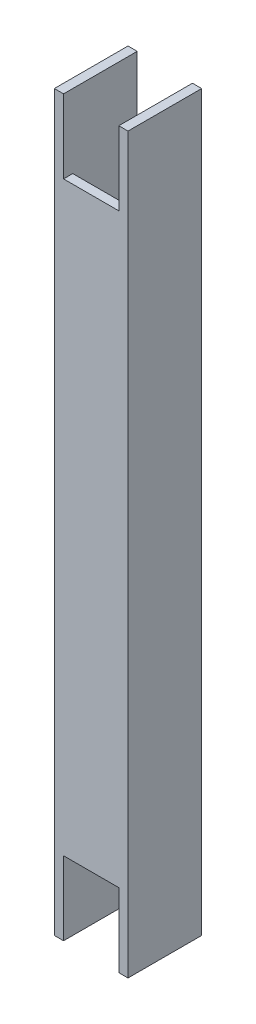
ISO-10303-21;
HEADER;
FILE_DESCRIPTION(('STEP AP214'),'2;1');
FILE_NAME('part.step','',(''),(''),'','','');
FILE_SCHEMA(('AUTOMOTIVE_DESIGN { 1 0 10303 214 1 1 1 1 }'));
ENDSEC;
DATA;
#1=APPLICATION_CONTEXT('core data for automotive mechanical design processes');
#2=APPLICATION_PROTOCOL_DEFINITION('international standard','automotive_design',2000,#1);
#3=PRODUCT_CONTEXT('',#1,'mechanical');
#4=PRODUCT('Part','Part','',(#3));
#5=PRODUCT_RELATED_PRODUCT_CATEGORY('part','',(#4));
#6=PRODUCT_DEFINITION_FORMATION('','',#4);
#7=PRODUCT_DEFINITION_CONTEXT('part definition',#1,'design');
#8=PRODUCT_DEFINITION('design','',#6,#7);
#9=PRODUCT_DEFINITION_SHAPE('','',#8);
#10=(LENGTH_UNIT() NAMED_UNIT(*) SI_UNIT(.MILLI.,.METRE.));
#11=(NAMED_UNIT(*) PLANE_ANGLE_UNIT() SI_UNIT($,.RADIAN.));
#12=(NAMED_UNIT(*) SI_UNIT($,.STERADIAN.) SOLID_ANGLE_UNIT());
#13=UNCERTAINTY_MEASURE_WITH_UNIT(LENGTH_MEASURE(1.E-05),#10,'distance_accuracy_value','');
#14=(GEOMETRIC_REPRESENTATION_CONTEXT(3) GLOBAL_UNCERTAINTY_ASSIGNED_CONTEXT((#13)) GLOBAL_UNIT_ASSIGNED_CONTEXT((#10,
#11,#12)) REPRESENTATION_CONTEXT('',''));
#15=CARTESIAN_POINT('',(0.,0.,0.));
#16=DIRECTION('',(0.,0.,1.));
#17=DIRECTION('',(1.,0.,0.));
#18=AXIS2_PLACEMENT_3D('',#15,#16,#17);
#19=CARTESIAN_POINT('',(0.,252.9,0.));
#20=DIRECTION('',(0.,-1.,0.));
#21=DIRECTION('',(-1.,0.,0.));
#22=AXIS2_PLACEMENT_3D('',#19,#20,#21);
#23=PLANE('',#22);
#24=DIRECTION('',(1.,0.,0.));
#25=VECTOR('',#24,1.);
#26=CARTESIAN_POINT('',(0.,252.9,0.));
#27=LINE('',#26,#25);
#28=CARTESIAN_POINT('',(0.,252.9,0.));
#29=VERTEX_POINT('',#28);
#30=CARTESIAN_POINT('',(3.175,252.9,0.));
#31=VERTEX_POINT('',#30);
#32=EDGE_CURVE('E127',#29,#31,#27,.T.);
#33=ORIENTED_EDGE('',*,*,#32,.T.);
#34=DIRECTION('',(0.,0.,-1.));
#35=VECTOR('',#34,1.);
#36=CARTESIAN_POINT('',(3.175,252.9,-25.4));
#37=LINE('',#36,#35);
#38=CARTESIAN_POINT('',(3.175,252.9,-25.4));
#39=VERTEX_POINT('',#38);
#40=EDGE_CURVE('E122',#39,#31,#37,.F.);
#41=ORIENTED_EDGE('',*,*,#40,.F.);
#42=DIRECTION('',(1.,0.,0.));
#43=VECTOR('',#42,1.);
#44=CARTESIAN_POINT('',(0.,252.9,-25.4));
#45=LINE('',#44,#43);
#46=CARTESIAN_POINT('',(0.,252.9,-25.4));
#47=VERTEX_POINT('',#46);
#48=EDGE_CURVE('E104',#47,#39,#45,.T.);
#49=ORIENTED_EDGE('',*,*,#48,.F.);
#50=DIRECTION('',(0.,0.,1.));
#51=VECTOR('',#50,1.);
#52=CARTESIAN_POINT('',(0.,252.9,-25.4));
#53=LINE('',#52,#51);
#54=EDGE_CURVE('E113',#47,#29,#53,.T.);
#55=ORIENTED_EDGE('',*,*,#54,.T.);
#56=EDGE_LOOP('',(#33,#41,#49,#55));
#57=FACE_BOUND('',#56,.T.);
#58=ADVANCED_FACE('F33',(#57),#23,.F.);
#59=CARTESIAN_POINT('',(0.,0.,0.));
#60=DIRECTION('',(0.,-1.,0.));
#61=DIRECTION('',(-1.,0.,0.));
#62=AXIS2_PLACEMENT_3D('',#59,#60,#61);
#63=PLANE('',#62);
#64=DIRECTION('',(0.,0.,-1.));
#65=VECTOR('',#64,1.);
#66=CARTESIAN_POINT('',(3.175,0.,-25.4));
#67=LINE('',#66,#65);
#68=CARTESIAN_POINT('',(3.175,0.,-25.4));
#69=VERTEX_POINT('',#68);
#70=CARTESIAN_POINT('',(3.175,0.,0.));
#71=VERTEX_POINT('',#70);
#72=EDGE_CURVE('E140',#69,#71,#67,.F.);
#73=ORIENTED_EDGE('',*,*,#72,.T.);
#74=DIRECTION('',(1.,0.,0.));
#75=VECTOR('',#74,1.);
#76=CARTESIAN_POINT('',(0.,0.,0.));
#77=LINE('',#76,#75);
#78=CARTESIAN_POINT('',(0.,0.,0.));
#79=VERTEX_POINT('',#78);
#80=EDGE_CURVE('E146',#79,#71,#77,.T.);
#81=ORIENTED_EDGE('',*,*,#80,.F.);
#82=DIRECTION('',(0.,0.,1.));
#83=VECTOR('',#82,1.);
#84=CARTESIAN_POINT('',(0.,0.,-25.4));
#85=LINE('',#84,#83);
#86=CARTESIAN_POINT('',(0.,0.,-25.4));
#87=VERTEX_POINT('',#86);
#88=EDGE_CURVE('E144',#87,#79,#85,.T.);
#89=ORIENTED_EDGE('',*,*,#88,.F.);
#90=DIRECTION('',(1.,0.,0.));
#91=VECTOR('',#90,1.);
#92=CARTESIAN_POINT('',(0.,0.,-25.4));
#93=LINE('',#92,#91);
#94=EDGE_CURVE('E106',#87,#69,#93,.T.);
#95=ORIENTED_EDGE('',*,*,#94,.T.);
#96=EDGE_LOOP('',(#73,#81,#89,#95));
#97=FACE_BOUND('',#96,.T.);
#98=ADVANCED_FACE('F247',(#97),#63,.T.);
#99=CARTESIAN_POINT('',(25.4,252.9,0.));
#100=DIRECTION('',(-1.,0.,0.));
#101=DIRECTION('',(0.,0.,1.));
#102=AXIS2_PLACEMENT_3D('',#99,#100,#101);
#103=PLANE('',#102);
#104=DIRECTION('',(0.,0.,-1.));
#105=VECTOR('',#104,1.);
#106=CARTESIAN_POINT('',(25.4,0.,0.));
#107=LINE('',#106,#105);
#108=CARTESIAN_POINT('',(25.4,0.,0.));
#109=VERTEX_POINT('',#108);
#110=CARTESIAN_POINT('',(25.4,0.,-25.4));
#111=VERTEX_POINT('',#110);
#112=EDGE_CURVE('E130',#109,#111,#107,.T.);
#113=ORIENTED_EDGE('',*,*,#112,.T.);
#114=DIRECTION('',(0.,-1.,0.));
#115=VECTOR('',#114,1.);
#116=CARTESIAN_POINT('',(25.4,252.9,-25.4));
#117=LINE('',#116,#115);
#118=CARTESIAN_POINT('',(25.4,252.9,-25.4));
#119=VERTEX_POINT('',#118);
#120=EDGE_CURVE('E11',#119,#111,#117,.T.);
#121=ORIENTED_EDGE('',*,*,#120,.F.);
#122=DIRECTION('',(0.,0.,-1.));
#123=VECTOR('',#122,1.);
#124=CARTESIAN_POINT('',(25.4,252.9,0.));
#125=LINE('',#124,#123);
#126=CARTESIAN_POINT('',(25.4,252.9,0.));
#127=VERTEX_POINT('',#126);
#128=EDGE_CURVE('E86',#127,#119,#125,.T.);
#129=ORIENTED_EDGE('',*,*,#128,.F.);
#130=DIRECTION('',(0.,-1.,0.));
#131=VECTOR('',#130,1.);
#132=CARTESIAN_POINT('',(25.4,252.9,0.));
#133=LINE('',#132,#131);
#134=EDGE_CURVE('E129',#127,#109,#133,.T.);
#135=ORIENTED_EDGE('',*,*,#134,.T.);
#136=EDGE_LOOP('',(#113,#121,#129,#135));
#137=FACE_BOUND('',#136,.T.);
#138=ADVANCED_FACE('F35',(#137),#103,.F.);
#139=CARTESIAN_POINT('',(22.225,252.9,-25.4));
#140=DIRECTION('',(0.,0.,-1.));
#141=DIRECTION('',(-1.,0.,0.));
#142=AXIS2_PLACEMENT_3D('',#139,#140,#141);
#143=PLANE('',#142);
#144=DIRECTION('',(1.,0.,0.));
#145=VECTOR('',#144,1.);
#146=CARTESIAN_POINT('',(22.225,0.,-25.4));
#147=LINE('',#146,#145);
#148=CARTESIAN_POINT('',(22.225,0.,-25.4));
#149=VERTEX_POINT('',#148);
#150=EDGE_CURVE('E133',#149,#111,#147,.T.);
#151=ORIENTED_EDGE('',*,*,#150,.F.);
#152=DIRECTION('',(0.,-1.,0.));
#153=VECTOR('',#152,1.);
#154=CARTESIAN_POINT('',(22.225,252.9,-25.4));
#155=LINE('',#154,#153);
#156=CARTESIAN_POINT('',(22.225,252.9,-25.4));
#157=VERTEX_POINT('',#156);
#158=EDGE_CURVE('E41',#157,#149,#155,.T.);
#159=ORIENTED_EDGE('',*,*,#158,.F.);
#160=DIRECTION('',(1.,0.,0.));
#161=VECTOR('',#160,1.);
#162=CARTESIAN_POINT('',(22.225,252.9,-25.4));
#163=LINE('',#162,#161);
#164=EDGE_CURVE('E237',#157,#119,#163,.T.);
#165=ORIENTED_EDGE('',*,*,#164,.T.);
#166=ORIENTED_EDGE('',*,*,#120,.T.);
#167=EDGE_LOOP('',(#151,#159,#165,#166));
#168=FACE_BOUND('',#167,.T.);
#169=ADVANCED_FACE('F165',(#168),#143,.T.);
#170=CARTESIAN_POINT('',(22.225,252.9,0.));
#171=DIRECTION('',(-1.,0.,0.));
#172=DIRECTION('',(0.,0.,1.));
#173=AXIS2_PLACEMENT_3D('',#170,#171,#172);
#174=PLANE('',#173);
#175=DIRECTION('',(0.,0.,-1.));
#176=VECTOR('',#175,1.);
#177=CARTESIAN_POINT('',(22.225,0.,0.));
#178=LINE('',#177,#176);
#179=CARTESIAN_POINT('',(22.225,0.,0.));
#180=VERTEX_POINT('',#179);
#181=EDGE_CURVE('E137',#180,#149,#178,.T.);
#182=ORIENTED_EDGE('',*,*,#181,.F.);
#183=DIRECTION('',(0.,-1.,0.));
#184=VECTOR('',#183,1.);
#185=CARTESIAN_POINT('',(22.225,0.,0.));
#186=LINE('',#185,#184);
#187=CARTESIAN_POINT('',(22.225,25.4,0.));
#188=VERTEX_POINT('',#187);
#189=EDGE_CURVE('E231',#188,#180,#186,.T.);
#190=ORIENTED_EDGE('',*,*,#189,.F.);
#191=DIRECTION('',(0.,0.,-1.));
#192=VECTOR('',#191,1.);
#193=CARTESIAN_POINT('',(22.225,25.4,0.));
#194=LINE('',#193,#192);
#195=CARTESIAN_POINT('',(22.225,25.4,-3.175));
#196=VERTEX_POINT('',#195);
#197=EDGE_CURVE('E188',#188,#196,#194,.T.);
#198=ORIENTED_EDGE('',*,*,#197,.T.);
#199=DIRECTION('',(0.,-1.,0.));
#200=VECTOR('',#199,1.);
#201=CARTESIAN_POINT('',(22.225,252.9,-3.175));
#202=LINE('',#201,#200);
#203=CARTESIAN_POINT('',(22.225,227.5,-3.175));
#204=VERTEX_POINT('',#203);
#205=EDGE_CURVE('E155',#204,#196,#202,.T.);
#206=ORIENTED_EDGE('',*,*,#205,.F.);
#207=DIRECTION('',(0.,0.,-1.));
#208=VECTOR('',#207,1.);
#209=CARTESIAN_POINT('',(22.225,227.5,0.));
#210=LINE('',#209,#208);
#211=CARTESIAN_POINT('',(22.225,227.5,0.));
#212=VERTEX_POINT('',#211);
#213=EDGE_CURVE('E220',#212,#204,#210,.T.);
#214=ORIENTED_EDGE('',*,*,#213,.F.);
#215=DIRECTION('',(0.,-1.,0.));
#216=VECTOR('',#215,1.);
#217=CARTESIAN_POINT('',(22.225,252.9,0.));
#218=LINE('',#217,#216);
#219=CARTESIAN_POINT('',(22.225,252.9,0.));
#220=VERTEX_POINT('',#219);
#221=EDGE_CURVE('E213',#220,#212,#218,.T.);
#222=ORIENTED_EDGE('',*,*,#221,.F.);
#223=DIRECTION('',(0.,0.,-1.));
#224=VECTOR('',#223,1.);
#225=CARTESIAN_POINT('',(22.225,252.9,0.));
#226=LINE('',#225,#224);
#227=EDGE_CURVE('E48',#220,#157,#226,.T.);
#228=ORIENTED_EDGE('',*,*,#227,.T.);
#229=ORIENTED_EDGE('',*,*,#158,.T.);
#230=EDGE_LOOP('',(#182,#190,#198,#206,#214,#222,#228,#229));
#231=FACE_BOUND('',#230,.T.);
#232=ADVANCED_FACE('F160',(#231),#174,.T.);
#233=CARTESIAN_POINT('',(0.,252.9,-3.175));
#234=DIRECTION('',(0.,0.,-1.));
#235=DIRECTION('',(-1.,0.,0.));
#236=AXIS2_PLACEMENT_3D('',#233,#234,#235);
#237=PLANE('',#236);
#238=DIRECTION('',(-1.,0.,0.));
#239=VECTOR('',#238,1.);
#240=CARTESIAN_POINT('',(3.175,227.5,-3.175));
#241=LINE('',#240,#239);
#242=CARTESIAN_POINT('',(3.175,227.5,-3.175));
#243=VERTEX_POINT('',#242);
#244=EDGE_CURVE('E214',#204,#243,#241,.T.);
#245=ORIENTED_EDGE('',*,*,#244,.F.);
#246=ORIENTED_EDGE('',*,*,#205,.T.);
#247=DIRECTION('',(1.,0.,0.));
#248=VECTOR('',#247,1.);
#249=CARTESIAN_POINT('',(3.175,25.4,-3.175));
#250=LINE('',#249,#248);
#251=CARTESIAN_POINT('',(3.175,25.4,-3.175));
#252=VERTEX_POINT('',#251);
#253=EDGE_CURVE('E228',#252,#196,#250,.T.);
#254=ORIENTED_EDGE('',*,*,#253,.F.);
#255=DIRECTION('',(0.,-1.,0.));
#256=VECTOR('',#255,1.);
#257=CARTESIAN_POINT('',(3.175,252.9,-3.175));
#258=LINE('',#257,#256);
#259=EDGE_CURVE('E152',#243,#252,#258,.T.);
#260=ORIENTED_EDGE('',*,*,#259,.F.);
#261=EDGE_LOOP('',(#245,#246,#254,#260));
#262=FACE_BOUND('',#261,.T.);
#263=ADVANCED_FACE('F268',(#262),#237,.T.);
#264=CARTESIAN_POINT('',(3.175,252.9,-25.4));
#265=DIRECTION('',(1.,0.,0.));
#266=DIRECTION('',(0.,0.,-1.));
#267=AXIS2_PLACEMENT_3D('',#264,#265,#266);
#268=PLANE('',#267);
#269=ORIENTED_EDGE('',*,*,#72,.F.);
#270=DIRECTION('',(0.,-1.,0.));
#271=VECTOR('',#270,1.);
#272=CARTESIAN_POINT('',(3.175,252.9,-25.4));
#273=LINE('',#272,#271);
#274=EDGE_CURVE('E109',#39,#69,#273,.T.);
#275=ORIENTED_EDGE('',*,*,#274,.F.);
#276=ORIENTED_EDGE('',*,*,#40,.T.);
#277=DIRECTION('',(0.,1.,0.));
#278=VECTOR('',#277,1.);
#279=CARTESIAN_POINT('',(3.175,252.9,0.));
#280=LINE('',#279,#278);
#281=CARTESIAN_POINT('',(3.175,227.5,0.));
#282=VERTEX_POINT('',#281);
#283=EDGE_CURVE('E207',#282,#31,#280,.T.);
#284=ORIENTED_EDGE('',*,*,#283,.F.);
#285=DIRECTION('',(0.,0.,-1.));
#286=VECTOR('',#285,1.);
#287=CARTESIAN_POINT('',(3.175,227.5,0.));
#288=LINE('',#287,#286);
#289=EDGE_CURVE('E134',#282,#243,#288,.T.);
#290=ORIENTED_EDGE('',*,*,#289,.T.);
#291=ORIENTED_EDGE('',*,*,#259,.T.);
#292=DIRECTION('',(0.,0.,-1.));
#293=VECTOR('',#292,1.);
#294=CARTESIAN_POINT('',(3.175,25.4,0.));
#295=LINE('',#294,#293);
#296=CARTESIAN_POINT('',(3.175,25.4,0.));
#297=VERTEX_POINT('',#296);
#298=EDGE_CURVE('E184',#297,#252,#295,.T.);
#299=ORIENTED_EDGE('',*,*,#298,.F.);
#300=DIRECTION('',(0.,1.,0.));
#301=VECTOR('',#300,1.);
#302=CARTESIAN_POINT('',(3.175,0.,0.));
#303=LINE('',#302,#301);
#304=EDGE_CURVE('E224',#71,#297,#303,.T.);
#305=ORIENTED_EDGE('',*,*,#304,.F.);
#306=EDGE_LOOP('',(#269,#275,#276,#284,#290,#291,#299,#305));
#307=FACE_BOUND('',#306,.T.);
#308=ADVANCED_FACE('F206',(#307),#268,.T.);
#309=CARTESIAN_POINT('',(0.,252.9,-25.4));
#310=DIRECTION('',(0.,0.,-1.));
#311=DIRECTION('',(-1.,0.,0.));
#312=AXIS2_PLACEMENT_3D('',#309,#310,#311);
#313=PLANE('',#312);
#314=ORIENTED_EDGE('',*,*,#94,.F.);
#315=DIRECTION('',(0.,-1.,0.));
#316=VECTOR('',#315,1.);
#317=CARTESIAN_POINT('',(0.,252.9,-25.4));
#318=LINE('',#317,#316);
#319=EDGE_CURVE('E100',#47,#87,#318,.T.);
#320=ORIENTED_EDGE('',*,*,#319,.F.);
#321=ORIENTED_EDGE('',*,*,#48,.T.);
#322=ORIENTED_EDGE('',*,*,#274,.T.);
#323=EDGE_LOOP('',(#314,#320,#321,#322));
#324=FACE_BOUND('',#323,.T.);
#325=ADVANCED_FACE('F102',(#324),#313,.T.);
#326=CARTESIAN_POINT('',(0.,252.9,-25.4));
#327=DIRECTION('',(1.,0.,0.));
#328=DIRECTION('',(0.,0.,-1.));
#329=AXIS2_PLACEMENT_3D('',#326,#327,#328);
#330=PLANE('',#329);
#331=ORIENTED_EDGE('',*,*,#88,.T.);
#332=DIRECTION('',(0.,-1.,0.));
#333=VECTOR('',#332,1.);
#334=CARTESIAN_POINT('',(0.,252.9,0.));
#335=LINE('',#334,#333);
#336=EDGE_CURVE('E110',#29,#79,#335,.T.);
#337=ORIENTED_EDGE('',*,*,#336,.F.);
#338=ORIENTED_EDGE('',*,*,#54,.F.);
#339=ORIENTED_EDGE('',*,*,#319,.T.);
#340=EDGE_LOOP('',(#331,#337,#338,#339));
#341=FACE_BOUND('',#340,.T.);
#342=ADVANCED_FACE('F114',(#341),#330,.F.);
#343=CARTESIAN_POINT('',(0.,252.9,0.));
#344=DIRECTION('',(0.,0.,-1.));
#345=DIRECTION('',(-1.,0.,0.));
#346=AXIS2_PLACEMENT_3D('',#343,#344,#345);
#347=PLANE('',#346);
#348=DIRECTION('',(-1.,0.,0.));
#349=VECTOR('',#348,1.);
#350=CARTESIAN_POINT('',(3.175,227.5,0.));
#351=LINE('',#350,#349);
#352=EDGE_CURVE('E212',#212,#282,#351,.T.);
#353=ORIENTED_EDGE('',*,*,#352,.T.);
#354=ORIENTED_EDGE('',*,*,#283,.T.);
#355=ORIENTED_EDGE('',*,*,#32,.F.);
#356=ORIENTED_EDGE('',*,*,#336,.T.);
#357=ORIENTED_EDGE('',*,*,#80,.T.);
#358=ORIENTED_EDGE('',*,*,#304,.T.);
#359=DIRECTION('',(1.,0.,0.));
#360=VECTOR('',#359,1.);
#361=CARTESIAN_POINT('',(3.175,25.4,0.));
#362=LINE('',#361,#360);
#363=EDGE_CURVE('E227',#297,#188,#362,.T.);
#364=ORIENTED_EDGE('',*,*,#363,.T.);
#365=ORIENTED_EDGE('',*,*,#189,.T.);
#366=EDGE_CURVE('E81',#180,#109,#77,.T.);
#367=ORIENTED_EDGE('',*,*,#366,.T.);
#368=ORIENTED_EDGE('',*,*,#134,.F.);
#369=EDGE_CURVE('E54',#220,#127,#27,.T.);
#370=ORIENTED_EDGE('',*,*,#369,.F.);
#371=ORIENTED_EDGE('',*,*,#221,.T.);
#372=EDGE_LOOP('',(#353,#354,#355,#356,#357,#358,#364,#365,#367,#368,#370,#371));
#373=FACE_BOUND('',#372,.T.);
#374=ADVANCED_FACE('F209',(#373),#347,.F.);
#375=ORIENTED_EDGE('',*,*,#227,.F.);
#376=ORIENTED_EDGE('',*,*,#369,.T.);
#377=ORIENTED_EDGE('',*,*,#128,.T.);
#378=ORIENTED_EDGE('',*,*,#164,.F.);
#379=EDGE_LOOP('',(#375,#376,#377,#378));
#380=FACE_BOUND('',#379,.T.);
#381=ADVANCED_FACE('F238',(#380),#23,.F.);
#382=ORIENTED_EDGE('',*,*,#366,.F.);
#383=ORIENTED_EDGE('',*,*,#181,.T.);
#384=ORIENTED_EDGE('',*,*,#150,.T.);
#385=ORIENTED_EDGE('',*,*,#112,.F.);
#386=EDGE_LOOP('',(#382,#383,#384,#385));
#387=FACE_BOUND('',#386,.T.);
#388=ADVANCED_FACE('F168',(#387),#63,.T.);
#389=CARTESIAN_POINT('',(3.175,25.4,0.));
#390=DIRECTION('',(0.,1.,0.));
#391=DIRECTION('',(0.,0.,1.));
#392=AXIS2_PLACEMENT_3D('',#389,#390,#391);
#393=PLANE('',#392);
#394=ORIENTED_EDGE('',*,*,#253,.T.);
#395=ORIENTED_EDGE('',*,*,#197,.F.);
#396=ORIENTED_EDGE('',*,*,#363,.F.);
#397=ORIENTED_EDGE('',*,*,#298,.T.);
#398=EDGE_LOOP('',(#394,#395,#396,#397));
#399=FACE_BOUND('',#398,.T.);
#400=ADVANCED_FACE('F245',(#399),#393,.F.);
#401=CARTESIAN_POINT('',(3.175,227.5,0.));
#402=DIRECTION('',(0.,-1.,0.));
#403=DIRECTION('',(0.,0.,-1.));
#404=AXIS2_PLACEMENT_3D('',#401,#402,#403);
#405=PLANE('',#404);
#406=ORIENTED_EDGE('',*,*,#244,.T.);
#407=ORIENTED_EDGE('',*,*,#289,.F.);
#408=ORIENTED_EDGE('',*,*,#352,.F.);
#409=ORIENTED_EDGE('',*,*,#213,.T.);
#410=EDGE_LOOP('',(#406,#407,#408,#409));
#411=FACE_BOUND('',#410,.T.);
#412=ADVANCED_FACE('F331',(#411),#405,.F.);
#413=CLOSED_SHELL('',(#58,#98,#138,#169,#232,#263,#308,#325,#342,#374,#381,#388,#400,#412));
#414=MANIFOLD_SOLID_BREP('B2',#413);
#415=ADVANCED_BREP_SHAPE_REPRESENTATION('',(#18,#414),#14);
#416=SHAPE_DEFINITION_REPRESENTATION(#9,#415);
ENDSEC;
END-ISO-10303-21;
